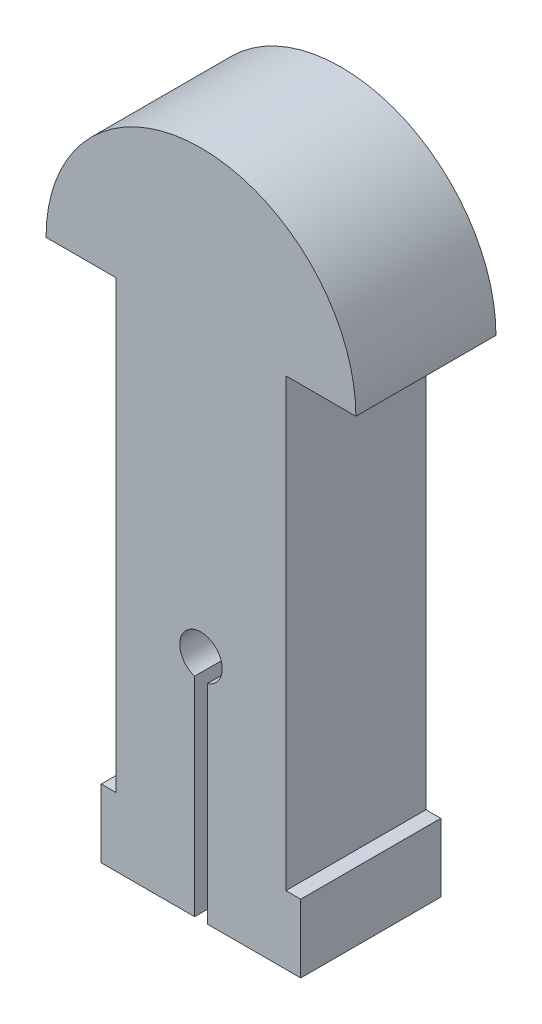
ISO-10303-21;
HEADER;
FILE_DESCRIPTION(('STEP AP214'),'2;1');
FILE_NAME('part.step','',(''),(''),'','','');
FILE_SCHEMA(('AUTOMOTIVE_DESIGN { 1 0 10303 214 1 1 1 1 }'));
ENDSEC;
DATA;
#1=APPLICATION_CONTEXT('core data for automotive mechanical design processes');
#2=APPLICATION_PROTOCOL_DEFINITION('international standard','automotive_design',2000,#1);
#3=PRODUCT_CONTEXT('',#1,'mechanical');
#4=PRODUCT('Part','Part','',(#3));
#5=PRODUCT_RELATED_PRODUCT_CATEGORY('part','',(#4));
#6=PRODUCT_DEFINITION_FORMATION('','',#4);
#7=PRODUCT_DEFINITION_CONTEXT('part definition',#1,'design');
#8=PRODUCT_DEFINITION('design','',#6,#7);
#9=PRODUCT_DEFINITION_SHAPE('','',#8);
#10=(LENGTH_UNIT() NAMED_UNIT(*) SI_UNIT(.MILLI.,.METRE.));
#11=(NAMED_UNIT(*) PLANE_ANGLE_UNIT() SI_UNIT($,.RADIAN.));
#12=(NAMED_UNIT(*) SI_UNIT($,.STERADIAN.) SOLID_ANGLE_UNIT());
#13=UNCERTAINTY_MEASURE_WITH_UNIT(LENGTH_MEASURE(1.E-05),#10,'distance_accuracy_value','');
#14=(GEOMETRIC_REPRESENTATION_CONTEXT(3) GLOBAL_UNCERTAINTY_ASSIGNED_CONTEXT((#13)) GLOBAL_UNIT_ASSIGNED_CONTEXT((#10,
#11,#12)) REPRESENTATION_CONTEXT('',''));
#15=CARTESIAN_POINT('',(0.,0.,0.));
#16=DIRECTION('',(0.,0.,1.));
#17=DIRECTION('',(1.,0.,0.));
#18=AXIS2_PLACEMENT_3D('',#15,#16,#17);
#19=CARTESIAN_POINT('',(2.,-9.43344449586801,3.3));
#20=DIRECTION('',(0.,-1.,0.));
#21=DIRECTION('',(0.,0.,-1.));
#22=AXIS2_PLACEMENT_3D('',#19,#20,#21);
#23=PLANE('',#22);
#24=DIRECTION('',(-1.,0.,0.));
#25=VECTOR('',#24,1.);
#26=CARTESIAN_POINT('',(2.,-9.43344449586801,0.));
#27=LINE('',#26,#25);
#28=CARTESIAN_POINT('',(2.35,-9.43344449586801,0.));
#29=VERTEX_POINT('',#28);
#30=CARTESIAN_POINT('',(2.,-9.43344449586801,0.));
#31=VERTEX_POINT('',#30);
#32=EDGE_CURVE('E181',#29,#31,#27,.T.);
#33=ORIENTED_EDGE('',*,*,#32,.T.);
#34=DIRECTION('',(0.,0.,-1.));
#35=VECTOR('',#34,1.);
#36=CARTESIAN_POINT('',(2.,-9.43344449586801,3.3));
#37=LINE('',#36,#35);
#38=CARTESIAN_POINT('',(2.,-9.43344449586801,3.3));
#39=VERTEX_POINT('',#38);
#40=EDGE_CURVE('E11',#39,#31,#37,.T.);
#41=ORIENTED_EDGE('',*,*,#40,.F.);
#42=DIRECTION('',(-1.,0.,0.));
#43=VECTOR('',#42,1.);
#44=CARTESIAN_POINT('',(2.,-9.43344449586801,3.3));
#45=LINE('',#44,#43);
#46=CARTESIAN_POINT('',(2.35,-9.43344449586801,3.3));
#47=VERTEX_POINT('',#46);
#48=EDGE_CURVE('E223',#47,#39,#45,.T.);
#49=ORIENTED_EDGE('',*,*,#48,.F.);
#50=DIRECTION('',(0.,0.,-1.));
#51=VECTOR('',#50,1.);
#52=CARTESIAN_POINT('',(2.35,-9.43344449586801,3.3));
#53=LINE('',#52,#51);
#54=EDGE_CURVE('E180',#47,#29,#53,.T.);
#55=ORIENTED_EDGE('',*,*,#54,.T.);
#56=EDGE_LOOP('',(#33,#41,#49,#55));
#57=FACE_BOUND('',#56,.T.);
#58=ADVANCED_FACE('F44',(#57),#23,.F.);
#59=CARTESIAN_POINT('',(2.,1.07087964413199,3.3));
#60=DIRECTION('',(-1.,0.,0.));
#61=DIRECTION('',(0.,-1.,0.));
#62=AXIS2_PLACEMENT_3D('',#59,#60,#61);
#63=PLANE('',#62);
#64=DIRECTION('',(0.,1.,0.));
#65=VECTOR('',#64,1.);
#66=CARTESIAN_POINT('',(2.,1.07087964413199,0.));
#67=LINE('',#66,#65);
#68=CARTESIAN_POINT('',(2.,1.07087964413199,0.));
#69=VERTEX_POINT('',#68);
#70=EDGE_CURVE('E184',#31,#69,#67,.T.);
#71=ORIENTED_EDGE('',*,*,#70,.T.);
#72=DIRECTION('',(0.,0.,-1.));
#73=VECTOR('',#72,1.);
#74=CARTESIAN_POINT('',(2.,1.07087964413199,3.3));
#75=LINE('',#74,#73);
#76=CARTESIAN_POINT('',(2.,1.07087964413199,3.3));
#77=VERTEX_POINT('',#76);
#78=EDGE_CURVE('E53',#77,#69,#75,.T.);
#79=ORIENTED_EDGE('',*,*,#78,.F.);
#80=DIRECTION('',(0.,1.,0.));
#81=VECTOR('',#80,1.);
#82=CARTESIAN_POINT('',(2.,1.07087964413199,3.3));
#83=LINE('',#82,#81);
#84=EDGE_CURVE('E121',#39,#77,#83,.T.);
#85=ORIENTED_EDGE('',*,*,#84,.F.);
#86=ORIENTED_EDGE('',*,*,#40,.T.);
#87=EDGE_LOOP('',(#71,#79,#85,#86));
#88=FACE_BOUND('',#87,.T.);
#89=ADVANCED_FACE('F332',(#88),#63,.F.);
#90=CARTESIAN_POINT('',(2.,1.07087964413199,3.3));
#91=DIRECTION('',(0.,1.,0.));
#92=DIRECTION('',(-1.,0.,0.));
#93=AXIS2_PLACEMENT_3D('',#90,#91,#92);
#94=PLANE('',#93);
#95=DIRECTION('',(1.,0.,0.));
#96=VECTOR('',#95,1.);
#97=CARTESIAN_POINT('',(2.,1.07087964413199,0.));
#98=LINE('',#97,#96);
#99=CARTESIAN_POINT('',(3.65,1.07087964413199,0.));
#100=VERTEX_POINT('',#99);
#101=EDGE_CURVE('E187',#69,#100,#98,.T.);
#102=ORIENTED_EDGE('',*,*,#101,.T.);
#103=DIRECTION('',(0.,0.,-1.));
#104=VECTOR('',#103,1.);
#105=CARTESIAN_POINT('',(3.65,1.07087964413199,3.3));
#106=LINE('',#105,#104);
#107=CARTESIAN_POINT('',(3.65,1.07087964413199,3.3));
#108=VERTEX_POINT('',#107);
#109=EDGE_CURVE('E256',#108,#100,#106,.T.);
#110=ORIENTED_EDGE('',*,*,#109,.F.);
#111=DIRECTION('',(1.,0.,0.));
#112=VECTOR('',#111,1.);
#113=CARTESIAN_POINT('',(2.,1.07087964413199,3.3));
#114=LINE('',#113,#112);
#115=EDGE_CURVE('E268',#77,#108,#114,.T.);
#116=ORIENTED_EDGE('',*,*,#115,.F.);
#117=ORIENTED_EDGE('',*,*,#78,.T.);
#118=EDGE_LOOP('',(#102,#110,#116,#117));
#119=FACE_BOUND('',#118,.T.);
#120=ADVANCED_FACE('F266',(#119),#94,.F.);
#121=CARTESIAN_POINT('',(0.,1.07087964413199,3.3));
#122=DIRECTION('',(0.,0.,-1.));
#123=DIRECTION('',(-1.,0.,0.));
#124=AXIS2_PLACEMENT_3D('',#121,#122,#123);
#125=CYLINDRICAL_SURFACE('',#124,3.65);
#126=CARTESIAN_POINT('',(0.,1.07087964413199,0.));
#127=DIRECTION('',(0.,0.,1.));
#128=DIRECTION('',(-1.,0.,0.));
#129=AXIS2_PLACEMENT_3D('',#126,#127,#128);
#130=CIRCLE('',#129,3.65);
#131=CARTESIAN_POINT('',(-3.65,1.07087964413199,0.));
#132=VERTEX_POINT('',#131);
#133=EDGE_CURVE('E192',#100,#132,#130,.T.);
#134=ORIENTED_EDGE('',*,*,#133,.T.);
#135=DIRECTION('',(0.,0.,-1.));
#136=VECTOR('',#135,1.);
#137=CARTESIAN_POINT('',(-3.65,1.07087964413199,3.3));
#138=LINE('',#137,#136);
#139=CARTESIAN_POINT('',(-3.65,1.07087964413199,3.3));
#140=VERTEX_POINT('',#139);
#141=EDGE_CURVE('E251',#140,#132,#138,.T.);
#142=ORIENTED_EDGE('',*,*,#141,.F.);
#143=CARTESIAN_POINT('',(0.,1.07087964413199,3.3));
#144=DIRECTION('',(0.,0.,1.));
#145=DIRECTION('',(-1.,0.,0.));
#146=AXIS2_PLACEMENT_3D('',#143,#144,#145);
#147=CIRCLE('',#146,3.65);
#148=EDGE_CURVE('E289',#108,#140,#147,.T.);
#149=ORIENTED_EDGE('',*,*,#148,.F.);
#150=ORIENTED_EDGE('',*,*,#109,.T.);
#151=EDGE_LOOP('',(#134,#142,#149,#150));
#152=FACE_BOUND('',#151,.T.);
#153=ADVANCED_FACE('F280',(#152),#125,.T.);
#154=CARTESIAN_POINT('',(-2.,1.07087964413199,3.3));
#155=DIRECTION('',(0.,1.,0.));
#156=DIRECTION('',(-1.,0.,0.));
#157=AXIS2_PLACEMENT_3D('',#154,#155,#156);
#158=PLANE('',#157);
#159=DIRECTION('',(1.,0.,0.));
#160=VECTOR('',#159,1.);
#161=CARTESIAN_POINT('',(-2.,1.07087964413199,0.));
#162=LINE('',#161,#160);
#163=CARTESIAN_POINT('',(-2.,1.07087964413199,0.));
#164=VERTEX_POINT('',#163);
#165=EDGE_CURVE('E191',#132,#164,#162,.T.);
#166=ORIENTED_EDGE('',*,*,#165,.T.);
#167=DIRECTION('',(0.,0.,-1.));
#168=VECTOR('',#167,1.);
#169=CARTESIAN_POINT('',(-2.,1.07087964413199,3.3));
#170=LINE('',#169,#168);
#171=CARTESIAN_POINT('',(-2.,1.07087964413199,3.3));
#172=VERTEX_POINT('',#171);
#173=EDGE_CURVE('E248',#172,#164,#170,.T.);
#174=ORIENTED_EDGE('',*,*,#173,.F.);
#175=DIRECTION('',(1.,0.,0.));
#176=VECTOR('',#175,1.);
#177=CARTESIAN_POINT('',(-2.,1.07087964413199,3.3));
#178=LINE('',#177,#176);
#179=EDGE_CURVE('E284',#140,#172,#178,.T.);
#180=ORIENTED_EDGE('',*,*,#179,.F.);
#181=ORIENTED_EDGE('',*,*,#141,.T.);
#182=EDGE_LOOP('',(#166,#174,#180,#181));
#183=FACE_BOUND('',#182,.T.);
#184=ADVANCED_FACE('F282',(#183),#158,.F.);
#185=CARTESIAN_POINT('',(-2.,1.07087964413199,3.3));
#186=DIRECTION('',(1.,0.,0.));
#187=DIRECTION('',(0.,1.,0.));
#188=AXIS2_PLACEMENT_3D('',#185,#186,#187);
#189=PLANE('',#188);
#190=DIRECTION('',(0.,-1.,0.));
#191=VECTOR('',#190,1.);
#192=CARTESIAN_POINT('',(-2.,1.07087964413199,0.));
#193=LINE('',#192,#191);
#194=CARTESIAN_POINT('',(-2.,-9.43344449586801,0.));
#195=VERTEX_POINT('',#194);
#196=EDGE_CURVE('E199',#164,#195,#193,.T.);
#197=ORIENTED_EDGE('',*,*,#196,.T.);
#198=DIRECTION('',(0.,0.,-1.));
#199=VECTOR('',#198,1.);
#200=CARTESIAN_POINT('',(-2.,-9.43344449586801,3.3));
#201=LINE('',#200,#199);
#202=CARTESIAN_POINT('',(-2.,-9.43344449586801,3.3));
#203=VERTEX_POINT('',#202);
#204=EDGE_CURVE('E247',#203,#195,#201,.T.);
#205=ORIENTED_EDGE('',*,*,#204,.F.);
#206=DIRECTION('',(0.,-1.,0.));
#207=VECTOR('',#206,1.);
#208=CARTESIAN_POINT('',(-2.,1.07087964413199,3.3));
#209=LINE('',#208,#207);
#210=EDGE_CURVE('E287',#172,#203,#209,.T.);
#211=ORIENTED_EDGE('',*,*,#210,.F.);
#212=ORIENTED_EDGE('',*,*,#173,.T.);
#213=EDGE_LOOP('',(#197,#205,#211,#212));
#214=FACE_BOUND('',#213,.T.);
#215=ADVANCED_FACE('F341',(#214),#189,.F.);
#216=CARTESIAN_POINT('',(-2.,-9.43344449586801,3.3));
#217=DIRECTION('',(0.,-1.,0.));
#218=DIRECTION('',(0.,0.,-1.));
#219=AXIS2_PLACEMENT_3D('',#216,#217,#218);
#220=PLANE('',#219);
#221=DIRECTION('',(-1.,0.,0.));
#222=VECTOR('',#221,1.);
#223=CARTESIAN_POINT('',(-2.,-9.43344449586801,0.));
#224=LINE('',#223,#222);
#225=CARTESIAN_POINT('',(-2.35,-9.43344449586801,0.));
#226=VERTEX_POINT('',#225);
#227=EDGE_CURVE('E198',#195,#226,#224,.T.);
#228=ORIENTED_EDGE('',*,*,#227,.T.);
#229=DIRECTION('',(0.,0.,-1.));
#230=VECTOR('',#229,1.);
#231=CARTESIAN_POINT('',(-2.35,-9.43344449586801,3.3));
#232=LINE('',#231,#230);
#233=CARTESIAN_POINT('',(-2.35,-9.43344449586801,3.3));
#234=VERTEX_POINT('',#233);
#235=EDGE_CURVE('E244',#234,#226,#232,.T.);
#236=ORIENTED_EDGE('',*,*,#235,.F.);
#237=DIRECTION('',(-1.,0.,0.));
#238=VECTOR('',#237,1.);
#239=CARTESIAN_POINT('',(-2.,-9.43344449586801,3.3));
#240=LINE('',#239,#238);
#241=EDGE_CURVE('E292',#203,#234,#240,.T.);
#242=ORIENTED_EDGE('',*,*,#241,.F.);
#243=ORIENTED_EDGE('',*,*,#204,.T.);
#244=EDGE_LOOP('',(#228,#236,#242,#243));
#245=FACE_BOUND('',#244,.T.);
#246=ADVANCED_FACE('F347',(#245),#220,.F.);
#247=CARTESIAN_POINT('',(-2.35,-9.43344449586801,3.3));
#248=DIRECTION('',(1.,0.,0.));
#249=DIRECTION('',(0.,0.,-1.));
#250=AXIS2_PLACEMENT_3D('',#247,#248,#249);
#251=PLANE('',#250);
#252=DIRECTION('',(0.,-1.,0.));
#253=VECTOR('',#252,1.);
#254=CARTESIAN_POINT('',(-2.35,-9.43344449586801,0.));
#255=LINE('',#254,#253);
#256=CARTESIAN_POINT('',(-2.35,-11.041323230394,0.));
#257=VERTEX_POINT('',#256);
#258=EDGE_CURVE('E201',#226,#257,#255,.T.);
#259=ORIENTED_EDGE('',*,*,#258,.T.);
#260=DIRECTION('',(0.,0.,-1.));
#261=VECTOR('',#260,1.);
#262=CARTESIAN_POINT('',(-2.35,-11.041323230394,3.3));
#263=LINE('',#262,#261);
#264=CARTESIAN_POINT('',(-2.35,-11.041323230394,3.3));
#265=VERTEX_POINT('',#264);
#266=EDGE_CURVE('E239',#265,#257,#263,.T.);
#267=ORIENTED_EDGE('',*,*,#266,.F.);
#268=DIRECTION('',(0.,-1.,0.));
#269=VECTOR('',#268,1.);
#270=CARTESIAN_POINT('',(-2.35,-9.43344449586801,3.3));
#271=LINE('',#270,#269);
#272=EDGE_CURVE('E300',#234,#265,#271,.T.);
#273=ORIENTED_EDGE('',*,*,#272,.F.);
#274=ORIENTED_EDGE('',*,*,#235,.T.);
#275=EDGE_LOOP('',(#259,#267,#273,#274));
#276=FACE_BOUND('',#275,.T.);
#277=ADVANCED_FACE('F353',(#276),#251,.F.);
#278=CARTESIAN_POINT('',(-0.149999999999999,-11.041323230394,3.3));
#279=DIRECTION('',(0.,1.,0.));
#280=DIRECTION('',(0.,0.,1.));
#281=AXIS2_PLACEMENT_3D('',#278,#279,#280);
#282=PLANE('',#281);
#283=DIRECTION('',(1.,0.,0.));
#284=VECTOR('',#283,1.);
#285=CARTESIAN_POINT('',(-0.149999999999999,-11.041323230394,0.));
#286=LINE('',#285,#284);
#287=CARTESIAN_POINT('',(-0.149999999999999,-11.041323230394,0.));
#288=VERTEX_POINT('',#287);
#289=EDGE_CURVE('E207',#257,#288,#286,.T.);
#290=ORIENTED_EDGE('',*,*,#289,.T.);
#291=DIRECTION('',(0.,0.,-1.));
#292=VECTOR('',#291,1.);
#293=CARTESIAN_POINT('',(-0.149999999999999,-11.041323230394,3.3));
#294=LINE('',#293,#292);
#295=CARTESIAN_POINT('',(-0.149999999999999,-11.041323230394,3.3));
#296=VERTEX_POINT('',#295);
#297=EDGE_CURVE('E233',#296,#288,#294,.T.);
#298=ORIENTED_EDGE('',*,*,#297,.F.);
#299=DIRECTION('',(1.,0.,0.));
#300=VECTOR('',#299,1.);
#301=CARTESIAN_POINT('',(-0.149999999999999,-11.041323230394,3.3));
#302=LINE('',#301,#300);
#303=EDGE_CURVE('E303',#265,#296,#302,.T.);
#304=ORIENTED_EDGE('',*,*,#303,.F.);
#305=ORIENTED_EDGE('',*,*,#266,.T.);
#306=EDGE_LOOP('',(#290,#298,#304,#305));
#307=FACE_BOUND('',#306,.T.);
#308=ADVANCED_FACE('F352',(#307),#282,.F.);
#309=CARTESIAN_POINT('',(-0.149999999999999,-6.133444495868,3.3));
#310=DIRECTION('',(-1.,0.,0.));
#311=DIRECTION('',(0.,0.,1.));
#312=AXIS2_PLACEMENT_3D('',#309,#310,#311);
#313=PLANE('',#312);
#314=DIRECTION('',(0.,1.,0.));
#315=VECTOR('',#314,1.);
#316=CARTESIAN_POINT('',(-0.149999999999999,-6.133444495868,0.));
#317=LINE('',#316,#315);
#318=CARTESIAN_POINT('',(-0.149999999999999,-6.133444495868,0.));
#319=VERTEX_POINT('',#318);
#320=EDGE_CURVE('E208',#288,#319,#317,.T.);
#321=ORIENTED_EDGE('',*,*,#320,.T.);
#322=DIRECTION('',(0.,0.,-1.));
#323=VECTOR('',#322,1.);
#324=CARTESIAN_POINT('',(-0.149999999999999,-6.133444495868,3.3));
#325=LINE('',#324,#323);
#326=CARTESIAN_POINT('',(-0.149999999999999,-6.133444495868,3.3));
#327=VERTEX_POINT('',#326);
#328=EDGE_CURVE('E229',#327,#319,#325,.T.);
#329=ORIENTED_EDGE('',*,*,#328,.F.);
#330=DIRECTION('',(0.,1.,0.));
#331=VECTOR('',#330,1.);
#332=CARTESIAN_POINT('',(-0.149999999999999,-9.43344449586801,3.3));
#333=LINE('',#332,#331);
#334=EDGE_CURVE('E305',#296,#327,#333,.T.);
#335=ORIENTED_EDGE('',*,*,#334,.F.);
#336=ORIENTED_EDGE('',*,*,#297,.T.);
#337=EDGE_LOOP('',(#321,#329,#335,#336));
#338=FACE_BOUND('',#337,.T.);
#339=ADVANCED_FACE('F315',(#338),#313,.F.);
#340=CARTESIAN_POINT('',(0.,-5.65647489515953,3.3));
#341=DIRECTION('',(0.,0.,-1.));
#342=DIRECTION('',(-1.,0.,0.));
#343=AXIS2_PLACEMENT_3D('',#340,#341,#342);
#344=CYLINDRICAL_SURFACE('',#343,0.5);
#345=CARTESIAN_POINT('',(0.,-5.65647489515953,0.));
#346=DIRECTION('',(0.,0.,-1.));
#347=DIRECTION('',(-1.,0.,0.));
#348=AXIS2_PLACEMENT_3D('',#345,#346,#347);
#349=CIRCLE('',#348,0.5);
#350=CARTESIAN_POINT('',(0.150000000000001,-6.133444495868,0.));
#351=VERTEX_POINT('',#350);
#352=EDGE_CURVE('E211',#319,#351,#349,.T.);
#353=ORIENTED_EDGE('',*,*,#352,.T.);
#354=DIRECTION('',(0.,0.,-1.));
#355=VECTOR('',#354,1.);
#356=CARTESIAN_POINT('',(0.150000000000001,-6.133444495868,3.3));
#357=LINE('',#356,#355);
#358=CARTESIAN_POINT('',(0.150000000000001,-6.133444495868,3.3));
#359=VERTEX_POINT('',#358);
#360=EDGE_CURVE('E169',#359,#351,#357,.T.);
#361=ORIENTED_EDGE('',*,*,#360,.F.);
#362=CARTESIAN_POINT('',(0.,-5.65647489515953,3.3));
#363=DIRECTION('',(0.,0.,-1.));
#364=DIRECTION('',(-1.,0.,0.));
#365=AXIS2_PLACEMENT_3D('',#362,#363,#364);
#366=CIRCLE('',#365,0.5);
#367=EDGE_CURVE('E158',#327,#359,#366,.T.);
#368=ORIENTED_EDGE('',*,*,#367,.F.);
#369=ORIENTED_EDGE('',*,*,#328,.T.);
#370=EDGE_LOOP('',(#353,#361,#368,#369));
#371=FACE_BOUND('',#370,.T.);
#372=ADVANCED_FACE('F314',(#371),#344,.F.);
#373=CARTESIAN_POINT('',(0.150000000000001,-9.43344449586801,3.3));
#374=DIRECTION('',(1.,0.,0.));
#375=DIRECTION('',(0.,1.,0.));
#376=AXIS2_PLACEMENT_3D('',#373,#374,#375);
#377=PLANE('',#376);
#378=DIRECTION('',(0.,-1.,0.));
#379=VECTOR('',#378,1.);
#380=CARTESIAN_POINT('',(0.150000000000001,-9.43344449586801,0.));
#381=LINE('',#380,#379);
#382=CARTESIAN_POINT('',(0.150000000000001,-11.041323230394,0.));
#383=VERTEX_POINT('',#382);
#384=EDGE_CURVE('E166',#351,#383,#381,.T.);
#385=ORIENTED_EDGE('',*,*,#384,.T.);
#386=DIRECTION('',(0.,0.,-1.));
#387=VECTOR('',#386,1.);
#388=CARTESIAN_POINT('',(0.150000000000001,-11.041323230394,3.3));
#389=LINE('',#388,#387);
#390=CARTESIAN_POINT('',(0.150000000000001,-11.041323230394,3.3));
#391=VERTEX_POINT('',#390);
#392=EDGE_CURVE('E168',#391,#383,#389,.T.);
#393=ORIENTED_EDGE('',*,*,#392,.F.);
#394=DIRECTION('',(0.,-1.,0.));
#395=VECTOR('',#394,1.);
#396=CARTESIAN_POINT('',(0.150000000000001,-6.133444495868,3.3));
#397=LINE('',#396,#395);
#398=EDGE_CURVE('E151',#359,#391,#397,.T.);
#399=ORIENTED_EDGE('',*,*,#398,.F.);
#400=ORIENTED_EDGE('',*,*,#360,.T.);
#401=EDGE_LOOP('',(#385,#393,#399,#400));
#402=FACE_BOUND('',#401,.T.);
#403=ADVANCED_FACE('F167',(#402),#377,.F.);
#404=CARTESIAN_POINT('',(0.150000000000001,-11.041323230394,3.3));
#405=DIRECTION('',(0.,1.,0.));
#406=DIRECTION('',(0.,0.,1.));
#407=AXIS2_PLACEMENT_3D('',#404,#405,#406);
#408=PLANE('',#407);
#409=DIRECTION('',(1.,0.,0.));
#410=VECTOR('',#409,1.);
#411=CARTESIAN_POINT('',(0.150000000000001,-11.041323230394,0.));
#412=LINE('',#411,#410);
#413=CARTESIAN_POINT('',(2.35,-11.041323230394,0.));
#414=VERTEX_POINT('',#413);
#415=EDGE_CURVE('E106',#383,#414,#412,.T.);
#416=ORIENTED_EDGE('',*,*,#415,.T.);
#417=DIRECTION('',(0.,0.,-1.));
#418=VECTOR('',#417,1.);
#419=CARTESIAN_POINT('',(2.35,-11.041323230394,3.3));
#420=LINE('',#419,#418);
#421=CARTESIAN_POINT('',(2.35,-11.041323230394,3.3));
#422=VERTEX_POINT('',#421);
#423=EDGE_CURVE('E173',#422,#414,#420,.T.);
#424=ORIENTED_EDGE('',*,*,#423,.F.);
#425=DIRECTION('',(1.,0.,0.));
#426=VECTOR('',#425,1.);
#427=CARTESIAN_POINT('',(0.150000000000001,-11.041323230394,3.3));
#428=LINE('',#427,#426);
#429=EDGE_CURVE('E156',#391,#422,#428,.T.);
#430=ORIENTED_EDGE('',*,*,#429,.F.);
#431=ORIENTED_EDGE('',*,*,#392,.T.);
#432=EDGE_LOOP('',(#416,#424,#430,#431));
#433=FACE_BOUND('',#432,.T.);
#434=ADVANCED_FACE('F171',(#433),#408,.F.);
#435=CARTESIAN_POINT('',(2.35,-9.43344449586801,3.3));
#436=DIRECTION('',(-1.,0.,0.));
#437=DIRECTION('',(0.,0.,1.));
#438=AXIS2_PLACEMENT_3D('',#435,#436,#437);
#439=PLANE('',#438);
#440=DIRECTION('',(0.,1.,0.));
#441=VECTOR('',#440,1.);
#442=CARTESIAN_POINT('',(2.35,-9.43344449586801,0.));
#443=LINE('',#442,#441);
#444=EDGE_CURVE('E113',#414,#29,#443,.T.);
#445=ORIENTED_EDGE('',*,*,#444,.T.);
#446=ORIENTED_EDGE('',*,*,#54,.F.);
#447=DIRECTION('',(0.,1.,0.));
#448=VECTOR('',#447,1.);
#449=CARTESIAN_POINT('',(2.35,-9.43344449586801,3.3));
#450=LINE('',#449,#448);
#451=EDGE_CURVE('E64',#422,#47,#450,.T.);
#452=ORIENTED_EDGE('',*,*,#451,.F.);
#453=ORIENTED_EDGE('',*,*,#423,.T.);
#454=EDGE_LOOP('',(#445,#446,#452,#453));
#455=FACE_BOUND('',#454,.T.);
#456=ADVANCED_FACE('F319',(#455),#439,.F.);
#457=CARTESIAN_POINT('',(0.,-5.65647489515953,3.3));
#458=DIRECTION('',(0.,0.,-1.));
#459=DIRECTION('',(-1.,0.,0.));
#460=AXIS2_PLACEMENT_3D('',#457,#458,#459);
#461=PLANE('',#460);
#462=ORIENTED_EDGE('',*,*,#48,.T.);
#463=ORIENTED_EDGE('',*,*,#84,.T.);
#464=ORIENTED_EDGE('',*,*,#115,.T.);
#465=ORIENTED_EDGE('',*,*,#148,.T.);
#466=ORIENTED_EDGE('',*,*,#179,.T.);
#467=ORIENTED_EDGE('',*,*,#210,.T.);
#468=ORIENTED_EDGE('',*,*,#241,.T.);
#469=ORIENTED_EDGE('',*,*,#272,.T.);
#470=ORIENTED_EDGE('',*,*,#303,.T.);
#471=ORIENTED_EDGE('',*,*,#334,.T.);
#472=ORIENTED_EDGE('',*,*,#367,.T.);
#473=ORIENTED_EDGE('',*,*,#398,.T.);
#474=ORIENTED_EDGE('',*,*,#429,.T.);
#475=ORIENTED_EDGE('',*,*,#451,.T.);
#476=EDGE_LOOP('',(#462,#463,#464,#465,#466,#467,#468,#469,#470,#471,#472,#473,#474,#475));
#477=FACE_BOUND('',#476,.T.);
#478=ADVANCED_FACE('F157',(#477),#461,.F.);
#479=CARTESIAN_POINT('',(0.,-5.65647489515953,0.));
#480=DIRECTION('',(0.,0.,-1.));
#481=DIRECTION('',(-1.,0.,0.));
#482=AXIS2_PLACEMENT_3D('',#479,#480,#481);
#483=PLANE('',#482);
#484=ORIENTED_EDGE('',*,*,#32,.F.);
#485=ORIENTED_EDGE('',*,*,#444,.F.);
#486=ORIENTED_EDGE('',*,*,#415,.F.);
#487=ORIENTED_EDGE('',*,*,#384,.F.);
#488=ORIENTED_EDGE('',*,*,#352,.F.);
#489=ORIENTED_EDGE('',*,*,#320,.F.);
#490=ORIENTED_EDGE('',*,*,#289,.F.);
#491=ORIENTED_EDGE('',*,*,#258,.F.);
#492=ORIENTED_EDGE('',*,*,#227,.F.);
#493=ORIENTED_EDGE('',*,*,#196,.F.);
#494=ORIENTED_EDGE('',*,*,#165,.F.);
#495=ORIENTED_EDGE('',*,*,#133,.F.);
#496=ORIENTED_EDGE('',*,*,#101,.F.);
#497=ORIENTED_EDGE('',*,*,#70,.F.);
#498=EDGE_LOOP('',(#484,#485,#486,#487,#488,#489,#490,#491,#492,#493,#494,#495,#496,#497));
#499=FACE_BOUND('',#498,.T.);
#500=ADVANCED_FACE('F275',(#499),#483,.T.);
#501=CLOSED_SHELL('',(#58,#89,#120,#153,#184,#215,#246,#277,#308,#339,#372,#403,#434,#456,#478,#500));
#502=MANIFOLD_SOLID_BREP('B2',#501);
#503=ADVANCED_BREP_SHAPE_REPRESENTATION('',(#18,#502),#14);
#504=SHAPE_DEFINITION_REPRESENTATION(#9,#503);
ENDSEC;
END-ISO-10303-21;
